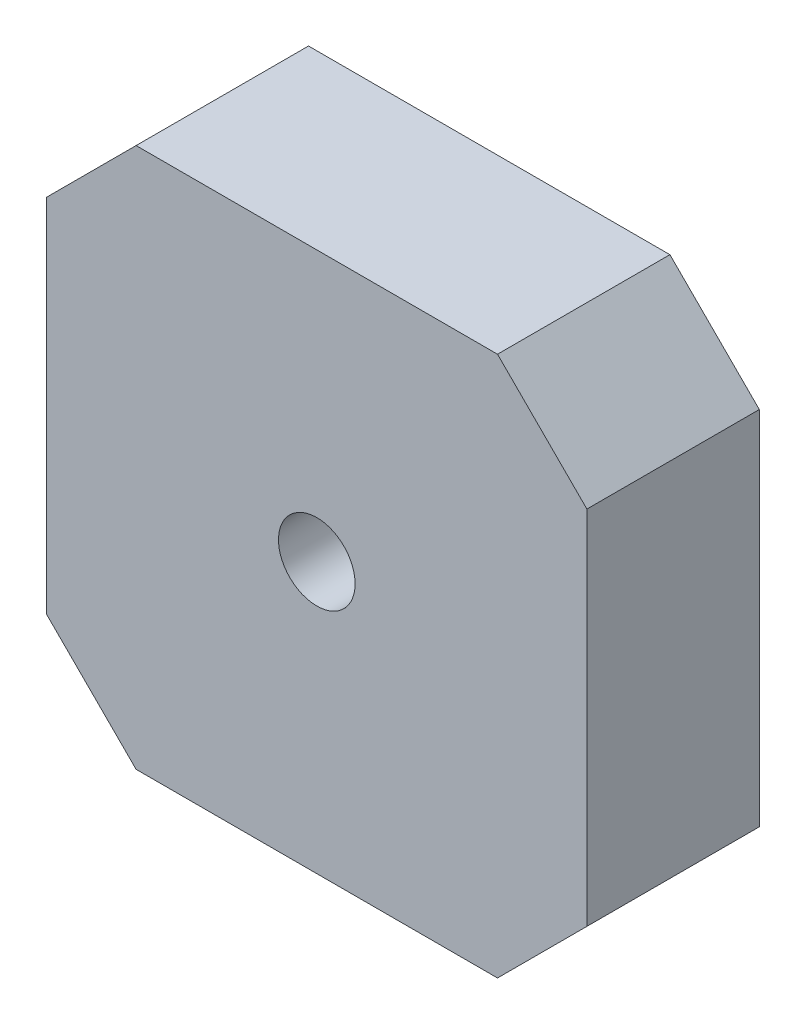
ISO-10303-21;
HEADER;
FILE_DESCRIPTION(('STEP AP214'),'2;1');
FILE_NAME('part.step','',(''),(''),'','','');
FILE_SCHEMA(('AUTOMOTIVE_DESIGN { 1 0 10303 214 1 1 1 1 }'));
ENDSEC;
DATA;
#1=APPLICATION_CONTEXT('core data for automotive mechanical design processes');
#2=APPLICATION_PROTOCOL_DEFINITION('international standard','automotive_design',2000,#1);
#3=PRODUCT_CONTEXT('',#1,'mechanical');
#4=PRODUCT('Part','Part','',(#3));
#5=PRODUCT_RELATED_PRODUCT_CATEGORY('part','',(#4));
#6=PRODUCT_DEFINITION_FORMATION('','',#4);
#7=PRODUCT_DEFINITION_CONTEXT('part definition',#1,'design');
#8=PRODUCT_DEFINITION('design','',#6,#7);
#9=PRODUCT_DEFINITION_SHAPE('','',#8);
#10=(LENGTH_UNIT() NAMED_UNIT(*) SI_UNIT(.MILLI.,.METRE.));
#11=(NAMED_UNIT(*) PLANE_ANGLE_UNIT() SI_UNIT($,.RADIAN.));
#12=(NAMED_UNIT(*) SI_UNIT($,.STERADIAN.) SOLID_ANGLE_UNIT());
#13=UNCERTAINTY_MEASURE_WITH_UNIT(LENGTH_MEASURE(1.E-05),#10,'distance_accuracy_value','');
#14=(GEOMETRIC_REPRESENTATION_CONTEXT(3) GLOBAL_UNCERTAINTY_ASSIGNED_CONTEXT((#13)) GLOBAL_UNIT_ASSIGNED_CONTEXT((#10,
#11,#12)) REPRESENTATION_CONTEXT('',''));
#15=CARTESIAN_POINT('',(0.,0.,0.));
#16=DIRECTION('',(0.,0.,1.));
#17=DIRECTION('',(1.,0.,0.));
#18=AXIS2_PLACEMENT_3D('',#15,#16,#17);
#19=CARTESIAN_POINT('',(-21.15,14.15,24.));
#20=DIRECTION('',(1.,0.,0.));
#21=DIRECTION('',(0.,0.,-1.));
#22=AXIS2_PLACEMENT_3D('',#19,#20,#21);
#23=PLANE('',#22);
#24=DIRECTION('',(0.,0.,1.));
#25=VECTOR('',#24,1.);
#26=CARTESIAN_POINT('',(-21.15,14.15,0.));
#27=LINE('',#26,#25);
#28=CARTESIAN_POINT('',(-21.15,14.15,0.));
#29=VERTEX_POINT('',#28);
#30=CARTESIAN_POINT('',(-21.15,14.15,13.5));
#31=VERTEX_POINT('',#30);
#32=EDGE_CURVE('E135',#29,#31,#27,.T.);
#33=ORIENTED_EDGE('',*,*,#32,.F.);
#34=DIRECTION('',(0.,1.,0.));
#35=VECTOR('',#34,1.);
#36=CARTESIAN_POINT('',(-21.15,-14.15,0.));
#37=LINE('',#36,#35);
#38=CARTESIAN_POINT('',(-21.15,-14.15,0.));
#39=VERTEX_POINT('',#38);
#40=EDGE_CURVE('E36',#39,#29,#37,.T.);
#41=ORIENTED_EDGE('',*,*,#40,.F.);
#42=DIRECTION('',(0.,0.,1.));
#43=VECTOR('',#42,1.);
#44=CARTESIAN_POINT('',(-21.15,-14.15,0.));
#45=LINE('',#44,#43);
#46=CARTESIAN_POINT('',(-21.15,-14.15,13.5));
#47=VERTEX_POINT('',#46);
#48=EDGE_CURVE('E11',#39,#47,#45,.T.);
#49=ORIENTED_EDGE('',*,*,#48,.T.);
#50=DIRECTION('',(0.,1.,0.));
#51=VECTOR('',#50,1.);
#52=CARTESIAN_POINT('',(-21.15,-14.15,13.5));
#53=LINE('',#52,#51);
#54=EDGE_CURVE('E27',#47,#31,#53,.T.);
#55=ORIENTED_EDGE('',*,*,#54,.T.);
#56=EDGE_LOOP('',(#33,#41,#49,#55));
#57=FACE_BOUND('',#56,.T.);
#58=ADVANCED_FACE('F17',(#57),#23,.F.);
#59=CARTESIAN_POINT('',(0.,0.,13.5));
#60=DIRECTION('',(0.,0.,1.));
#61=DIRECTION('',(1.,0.,0.));
#62=AXIS2_PLACEMENT_3D('',#59,#60,#61);
#63=PLANE('',#62);
#64=DIRECTION('',(-0.707106781186548,0.707106781186548,0.));
#65=VECTOR('',#64,1.);
#66=CARTESIAN_POINT('',(-14.15,-21.15,13.5));
#67=LINE('',#66,#65);
#68=CARTESIAN_POINT('',(-14.15,-21.15,13.5));
#69=VERTEX_POINT('',#68);
#70=EDGE_CURVE('E102',#69,#47,#67,.T.);
#71=ORIENTED_EDGE('',*,*,#70,.F.);
#72=DIRECTION('',(1.,0.,0.));
#73=VECTOR('',#72,1.);
#74=CARTESIAN_POINT('',(-14.15,-21.15,13.5));
#75=LINE('',#74,#73);
#76=CARTESIAN_POINT('',(14.15,-21.15,13.5));
#77=VERTEX_POINT('',#76);
#78=EDGE_CURVE('E101',#69,#77,#75,.T.);
#79=ORIENTED_EDGE('',*,*,#78,.T.);
#80=DIRECTION('',(-0.707106781186548,-0.707106781186548,0.));
#81=VECTOR('',#80,1.);
#82=CARTESIAN_POINT('',(21.15,-14.15,13.5));
#83=LINE('',#82,#81);
#84=CARTESIAN_POINT('',(21.15,-14.15,13.5));
#85=VERTEX_POINT('',#84);
#86=EDGE_CURVE('E113',#85,#77,#83,.T.);
#87=ORIENTED_EDGE('',*,*,#86,.F.);
#88=DIRECTION('',(0.,-1.,0.));
#89=VECTOR('',#88,1.);
#90=CARTESIAN_POINT('',(21.15,14.15,13.5));
#91=LINE('',#90,#89);
#92=CARTESIAN_POINT('',(21.15,14.15,13.5));
#93=VERTEX_POINT('',#92);
#94=EDGE_CURVE('E116',#93,#85,#91,.T.);
#95=ORIENTED_EDGE('',*,*,#94,.F.);
#96=DIRECTION('',(0.707106781186548,-0.707106781186548,0.));
#97=VECTOR('',#96,1.);
#98=CARTESIAN_POINT('',(14.15,21.15,13.5));
#99=LINE('',#98,#97);
#100=CARTESIAN_POINT('',(14.15,21.15,13.5));
#101=VERTEX_POINT('',#100);
#102=EDGE_CURVE('E125',#101,#93,#99,.T.);
#103=ORIENTED_EDGE('',*,*,#102,.F.);
#104=DIRECTION('',(1.,0.,0.));
#105=VECTOR('',#104,1.);
#106=CARTESIAN_POINT('',(-14.15,21.15,13.5));
#107=LINE('',#106,#105);
#108=CARTESIAN_POINT('',(-14.15,21.15,13.5));
#109=VERTEX_POINT('',#108);
#110=EDGE_CURVE('E130',#109,#101,#107,.T.);
#111=ORIENTED_EDGE('',*,*,#110,.F.);
#112=DIRECTION('',(0.707106781186548,0.707106781186548,0.));
#113=VECTOR('',#112,1.);
#114=CARTESIAN_POINT('',(-21.15,14.15,13.5));
#115=LINE('',#114,#113);
#116=EDGE_CURVE('E132',#31,#109,#115,.T.);
#117=ORIENTED_EDGE('',*,*,#116,.F.);
#118=ORIENTED_EDGE('',*,*,#54,.F.);
#119=EDGE_LOOP('',(#71,#79,#87,#95,#103,#111,#117,#118));
#120=FACE_BOUND('',#119,.T.);
#121=CARTESIAN_POINT('',(0.,0.,13.5));
#122=DIRECTION('',(0.,0.,-1.));
#123=DIRECTION('',(1.,0.,0.));
#124=AXIS2_PLACEMENT_3D('',#121,#122,#123);
#125=CIRCLE('',#124,3.);
#126=CARTESIAN_POINT('',(3.,0.,13.5));
#127=VERTEX_POINT('',#126);
#128=EDGE_CURVE('E137',#127,#127,#125,.T.);
#129=ORIENTED_EDGE('',*,*,#128,.T.);
#130=EDGE_LOOP('',(#129));
#131=FACE_BOUND('',#130,.T.);
#132=ADVANCED_FACE('F155',(#120,#131),#63,.T.);
#133=CARTESIAN_POINT('',(-14.15,21.15,24.));
#134=DIRECTION('',(0.707106781186548,-0.707106781186548,0.));
#135=DIRECTION('',(0.707106781186548,0.707106781186548,0.));
#136=AXIS2_PLACEMENT_3D('',#133,#134,#135);
#137=PLANE('',#136);
#138=DIRECTION('',(0.,0.,1.));
#139=VECTOR('',#138,1.);
#140=CARTESIAN_POINT('',(-14.15,21.15,0.));
#141=LINE('',#140,#139);
#142=CARTESIAN_POINT('',(-14.15,21.15,0.));
#143=VERTEX_POINT('',#142);
#144=EDGE_CURVE('E129',#143,#109,#141,.T.);
#145=ORIENTED_EDGE('',*,*,#144,.F.);
#146=DIRECTION('',(0.707106781186548,0.707106781186548,0.));
#147=VECTOR('',#146,1.);
#148=CARTESIAN_POINT('',(-21.15,14.15,0.));
#149=LINE('',#148,#147);
#150=EDGE_CURVE('E136',#29,#143,#149,.T.);
#151=ORIENTED_EDGE('',*,*,#150,.F.);
#152=ORIENTED_EDGE('',*,*,#32,.T.);
#153=ORIENTED_EDGE('',*,*,#116,.T.);
#154=EDGE_LOOP('',(#145,#151,#152,#153));
#155=FACE_BOUND('',#154,.T.);
#156=ADVANCED_FACE('F162',(#155),#137,.F.);
#157=CARTESIAN_POINT('',(0.,0.,0.));
#158=DIRECTION('',(0.,0.,1.));
#159=DIRECTION('',(1.,0.,0.));
#160=AXIS2_PLACEMENT_3D('',#157,#158,#159);
#161=PLANE('',#160);
#162=ORIENTED_EDGE('',*,*,#150,.T.);
#163=DIRECTION('',(1.,0.,0.));
#164=VECTOR('',#163,1.);
#165=CARTESIAN_POINT('',(-14.15,21.15,0.));
#166=LINE('',#165,#164);
#167=CARTESIAN_POINT('',(14.15,21.15,0.));
#168=VERTEX_POINT('',#167);
#169=EDGE_CURVE('E143',#143,#168,#166,.T.);
#170=ORIENTED_EDGE('',*,*,#169,.T.);
#171=DIRECTION('',(0.707106781186548,-0.707106781186548,0.));
#172=VECTOR('',#171,1.);
#173=CARTESIAN_POINT('',(14.15,21.15,0.));
#174=LINE('',#173,#172);
#175=CARTESIAN_POINT('',(21.15,14.15,0.));
#176=VERTEX_POINT('',#175);
#177=EDGE_CURVE('E146',#168,#176,#174,.T.);
#178=ORIENTED_EDGE('',*,*,#177,.T.);
#179=DIRECTION('',(0.,-1.,0.));
#180=VECTOR('',#179,1.);
#181=CARTESIAN_POINT('',(21.15,14.15,0.));
#182=LINE('',#181,#180);
#183=CARTESIAN_POINT('',(21.15,-14.15,0.));
#184=VERTEX_POINT('',#183);
#185=EDGE_CURVE('E149',#176,#184,#182,.T.);
#186=ORIENTED_EDGE('',*,*,#185,.T.);
#187=DIRECTION('',(-0.707106781186548,-0.707106781186548,0.));
#188=VECTOR('',#187,1.);
#189=CARTESIAN_POINT('',(21.15,-14.15,0.));
#190=LINE('',#189,#188);
#191=CARTESIAN_POINT('',(14.15,-21.15,0.));
#192=VERTEX_POINT('',#191);
#193=EDGE_CURVE('E95',#184,#192,#190,.T.);
#194=ORIENTED_EDGE('',*,*,#193,.T.);
#195=DIRECTION('',(-1.,0.,0.));
#196=VECTOR('',#195,1.);
#197=CARTESIAN_POINT('',(14.15,-21.15,0.));
#198=LINE('',#197,#196);
#199=CARTESIAN_POINT('',(-14.15,-21.15,0.));
#200=VERTEX_POINT('',#199);
#201=EDGE_CURVE('E81',#192,#200,#198,.T.);
#202=ORIENTED_EDGE('',*,*,#201,.T.);
#203=DIRECTION('',(-0.707106781186548,0.707106781186548,0.));
#204=VECTOR('',#203,1.);
#205=CARTESIAN_POINT('',(-14.15,-21.15,0.));
#206=LINE('',#205,#204);
#207=EDGE_CURVE('E87',#200,#39,#206,.T.);
#208=ORIENTED_EDGE('',*,*,#207,.T.);
#209=ORIENTED_EDGE('',*,*,#40,.T.);
#210=EDGE_LOOP('',(#162,#170,#178,#186,#194,#202,#208,#209));
#211=FACE_BOUND('',#210,.T.);
#212=CARTESIAN_POINT('',(0.,0.,0.));
#213=DIRECTION('',(0.,0.,-1.));
#214=DIRECTION('',(1.,0.,0.));
#215=AXIS2_PLACEMENT_3D('',#212,#213,#214);
#216=CIRCLE('',#215,3.);
#217=CARTESIAN_POINT('',(3.,0.,0.));
#218=VERTEX_POINT('',#217);
#219=EDGE_CURVE('E109',#218,#218,#216,.T.);
#220=ORIENTED_EDGE('',*,*,#219,.F.);
#221=EDGE_LOOP('',(#220));
#222=FACE_BOUND('',#221,.T.);
#223=ADVANCED_FACE('F92',(#211,#222),#161,.F.);
#224=CARTESIAN_POINT('',(-21.15,-14.15,24.));
#225=DIRECTION('',(0.707106781186548,0.707106781186548,0.));
#226=DIRECTION('',(-0.707106781186548,0.707106781186548,0.));
#227=AXIS2_PLACEMENT_3D('',#224,#225,#226);
#228=PLANE('',#227);
#229=ORIENTED_EDGE('',*,*,#48,.F.);
#230=ORIENTED_EDGE('',*,*,#207,.F.);
#231=DIRECTION('',(0.,0.,1.));
#232=VECTOR('',#231,1.);
#233=CARTESIAN_POINT('',(-14.15,-21.15,0.));
#234=LINE('',#233,#232);
#235=EDGE_CURVE('E90',#200,#69,#234,.T.);
#236=ORIENTED_EDGE('',*,*,#235,.T.);
#237=ORIENTED_EDGE('',*,*,#70,.T.);
#238=EDGE_LOOP('',(#229,#230,#236,#237));
#239=FACE_BOUND('',#238,.T.);
#240=ADVANCED_FACE('F88',(#239),#228,.F.);
#241=CARTESIAN_POINT('',(-14.15,-21.15,24.));
#242=DIRECTION('',(0.,1.,0.));
#243=DIRECTION('',(0.,0.,1.));
#244=AXIS2_PLACEMENT_3D('',#241,#242,#243);
#245=PLANE('',#244);
#246=ORIENTED_EDGE('',*,*,#235,.F.);
#247=ORIENTED_EDGE('',*,*,#201,.F.);
#248=DIRECTION('',(0.,0.,1.));
#249=VECTOR('',#248,1.);
#250=CARTESIAN_POINT('',(14.15,-21.15,0.));
#251=LINE('',#250,#249);
#252=EDGE_CURVE('E105',#192,#77,#251,.T.);
#253=ORIENTED_EDGE('',*,*,#252,.T.);
#254=ORIENTED_EDGE('',*,*,#78,.F.);
#255=EDGE_LOOP('',(#246,#247,#253,#254));
#256=FACE_BOUND('',#255,.T.);
#257=ADVANCED_FACE('F99',(#256),#245,.F.);
#258=CARTESIAN_POINT('',(21.15,-14.15,24.));
#259=DIRECTION('',(-0.707106781186548,0.707106781186548,0.));
#260=DIRECTION('',(-0.707106781186548,-0.707106781186548,0.));
#261=AXIS2_PLACEMENT_3D('',#258,#259,#260);
#262=PLANE('',#261);
#263=ORIENTED_EDGE('',*,*,#252,.F.);
#264=ORIENTED_EDGE('',*,*,#193,.F.);
#265=DIRECTION('',(0.,0.,1.));
#266=VECTOR('',#265,1.);
#267=CARTESIAN_POINT('',(21.15,-14.15,0.));
#268=LINE('',#267,#266);
#269=EDGE_CURVE('E111',#184,#85,#268,.T.);
#270=ORIENTED_EDGE('',*,*,#269,.T.);
#271=ORIENTED_EDGE('',*,*,#86,.T.);
#272=EDGE_LOOP('',(#263,#264,#270,#271));
#273=FACE_BOUND('',#272,.T.);
#274=ADVANCED_FACE('F153',(#273),#262,.F.);
#275=CARTESIAN_POINT('',(21.15,14.15,24.));
#276=DIRECTION('',(-1.,0.,0.));
#277=DIRECTION('',(0.,-1.,0.));
#278=AXIS2_PLACEMENT_3D('',#275,#276,#277);
#279=PLANE('',#278);
#280=ORIENTED_EDGE('',*,*,#269,.F.);
#281=ORIENTED_EDGE('',*,*,#185,.F.);
#282=DIRECTION('',(0.,0.,1.));
#283=VECTOR('',#282,1.);
#284=CARTESIAN_POINT('',(21.15,14.15,0.));
#285=LINE('',#284,#283);
#286=EDGE_CURVE('E114',#176,#93,#285,.T.);
#287=ORIENTED_EDGE('',*,*,#286,.T.);
#288=ORIENTED_EDGE('',*,*,#94,.T.);
#289=EDGE_LOOP('',(#280,#281,#287,#288));
#290=FACE_BOUND('',#289,.T.);
#291=ADVANCED_FACE('F151',(#290),#279,.F.);
#292=CARTESIAN_POINT('',(14.15,21.15,24.));
#293=DIRECTION('',(-0.707106781186548,-0.707106781186548,0.));
#294=DIRECTION('',(0.707106781186548,-0.707106781186548,0.));
#295=AXIS2_PLACEMENT_3D('',#292,#293,#294);
#296=PLANE('',#295);
#297=ORIENTED_EDGE('',*,*,#286,.F.);
#298=ORIENTED_EDGE('',*,*,#177,.F.);
#299=DIRECTION('',(0.,0.,1.));
#300=VECTOR('',#299,1.);
#301=CARTESIAN_POINT('',(14.15,21.15,0.));
#302=LINE('',#301,#300);
#303=EDGE_CURVE('E21',#168,#101,#302,.T.);
#304=ORIENTED_EDGE('',*,*,#303,.T.);
#305=ORIENTED_EDGE('',*,*,#102,.T.);
#306=EDGE_LOOP('',(#297,#298,#304,#305));
#307=FACE_BOUND('',#306,.T.);
#308=ADVANCED_FACE('F171',(#307),#296,.F.);
#309=CARTESIAN_POINT('',(-14.15,21.15,24.));
#310=DIRECTION('',(0.,-1.,0.));
#311=DIRECTION('',(0.,0.,-1.));
#312=AXIS2_PLACEMENT_3D('',#309,#310,#311);
#313=PLANE('',#312);
#314=ORIENTED_EDGE('',*,*,#303,.F.);
#315=ORIENTED_EDGE('',*,*,#169,.F.);
#316=ORIENTED_EDGE('',*,*,#144,.T.);
#317=ORIENTED_EDGE('',*,*,#110,.T.);
#318=EDGE_LOOP('',(#314,#315,#316,#317));
#319=FACE_BOUND('',#318,.T.);
#320=ADVANCED_FACE('F168',(#319),#313,.F.);
#321=CARTESIAN_POINT('',(0.,0.,13.5));
#322=DIRECTION('',(0.,0.,-1.));
#323=DIRECTION('',(-1.,0.,0.));
#324=AXIS2_PLACEMENT_3D('',#321,#322,#323);
#325=CYLINDRICAL_SURFACE('',#324,3.);
#326=ORIENTED_EDGE('',*,*,#219,.T.);
#327=EDGE_LOOP('',(#326));
#328=FACE_BOUND('',#327,.T.);
#329=ORIENTED_EDGE('',*,*,#128,.F.);
#330=EDGE_LOOP('',(#329));
#331=FACE_BOUND('',#330,.T.);
#332=ADVANCED_FACE('F19',(#328,#331),#325,.F.);
#333=CLOSED_SHELL('',(#58,#132,#156,#223,#240,#257,#274,#291,#308,#320,#332));
#334=MANIFOLD_SOLID_BREP('B1',#333);
#335=ADVANCED_BREP_SHAPE_REPRESENTATION('',(#18,#334),#14);
#336=SHAPE_DEFINITION_REPRESENTATION(#9,#335);
ENDSEC;
END-ISO-10303-21;
